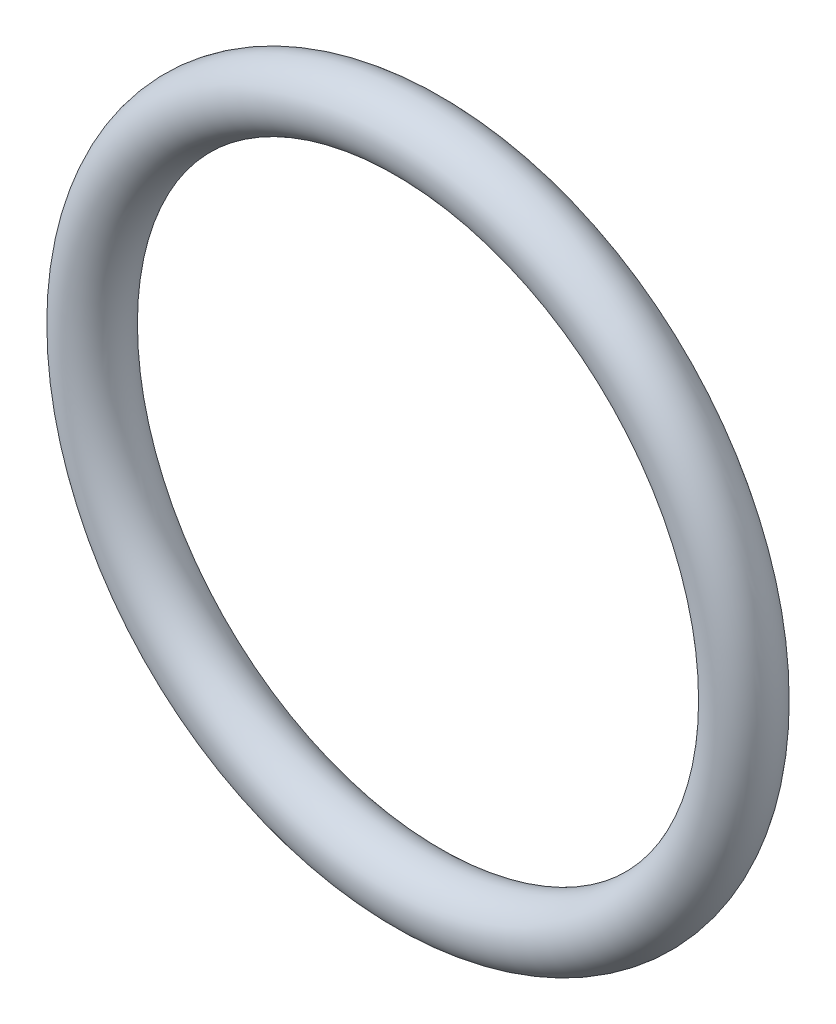
ISO-10303-21;
HEADER;
FILE_DESCRIPTION(('STEP AP214'),'2;1');
FILE_NAME('part.step','',(''),(''),'','','');
FILE_SCHEMA(('AUTOMOTIVE_DESIGN { 1 0 10303 214 1 1 1 1 }'));
ENDSEC;
DATA;
#1=APPLICATION_CONTEXT('core data for automotive mechanical design processes');
#2=APPLICATION_PROTOCOL_DEFINITION('international standard','automotive_design',2000,#1);
#3=PRODUCT_CONTEXT('',#1,'mechanical');
#4=PRODUCT('Part','Part','',(#3));
#5=PRODUCT_RELATED_PRODUCT_CATEGORY('part','',(#4));
#6=PRODUCT_DEFINITION_FORMATION('','',#4);
#7=PRODUCT_DEFINITION_CONTEXT('part definition',#1,'design');
#8=PRODUCT_DEFINITION('design','',#6,#7);
#9=PRODUCT_DEFINITION_SHAPE('','',#8);
#10=(LENGTH_UNIT() NAMED_UNIT(*) SI_UNIT(.MILLI.,.METRE.));
#11=(NAMED_UNIT(*) PLANE_ANGLE_UNIT() SI_UNIT($,.RADIAN.));
#12=(NAMED_UNIT(*) SI_UNIT($,.STERADIAN.) SOLID_ANGLE_UNIT());
#13=UNCERTAINTY_MEASURE_WITH_UNIT(LENGTH_MEASURE(1.E-05),#10,'distance_accuracy_value','');
#14=(GEOMETRIC_REPRESENTATION_CONTEXT(3) GLOBAL_UNCERTAINTY_ASSIGNED_CONTEXT((#13)) GLOBAL_UNIT_ASSIGNED_CONTEXT((#10,
#11,#12)) REPRESENTATION_CONTEXT('',''));
#15=CARTESIAN_POINT('',(0.,0.,0.));
#16=DIRECTION('',(0.,0.,1.));
#17=DIRECTION('',(1.,0.,0.));
#18=AXIS2_PLACEMENT_3D('',#15,#16,#17);
#19=CARTESIAN_POINT('',(0.,0.,0.));
#20=DIRECTION('',(0.,0.,-1.));
#21=DIRECTION('',(-1.,0.,0.));
#22=AXIS2_PLACEMENT_3D('',#19,#20,#21);
#23=TOROIDAL_SURFACE('',#22,7.747,0.761999999999999);
#24=CARTESIAN_POINT('',(-8.509,0.,0.));
#25=VERTEX_POINT('',#24);
#26=VERTEX_LOOP('',#25);
#27=FACE_BOUND('',#26,.T.);
#28=ADVANCED_FACE('F28',(#27),#23,.T.);
#29=CLOSED_SHELL('',(#28));
#30=MANIFOLD_SOLID_BREP('B2',#29);
#31=ADVANCED_BREP_SHAPE_REPRESENTATION('',(#18,#30),#14);
#32=SHAPE_DEFINITION_REPRESENTATION(#9,#31);
ENDSEC;
END-ISO-10303-21;
